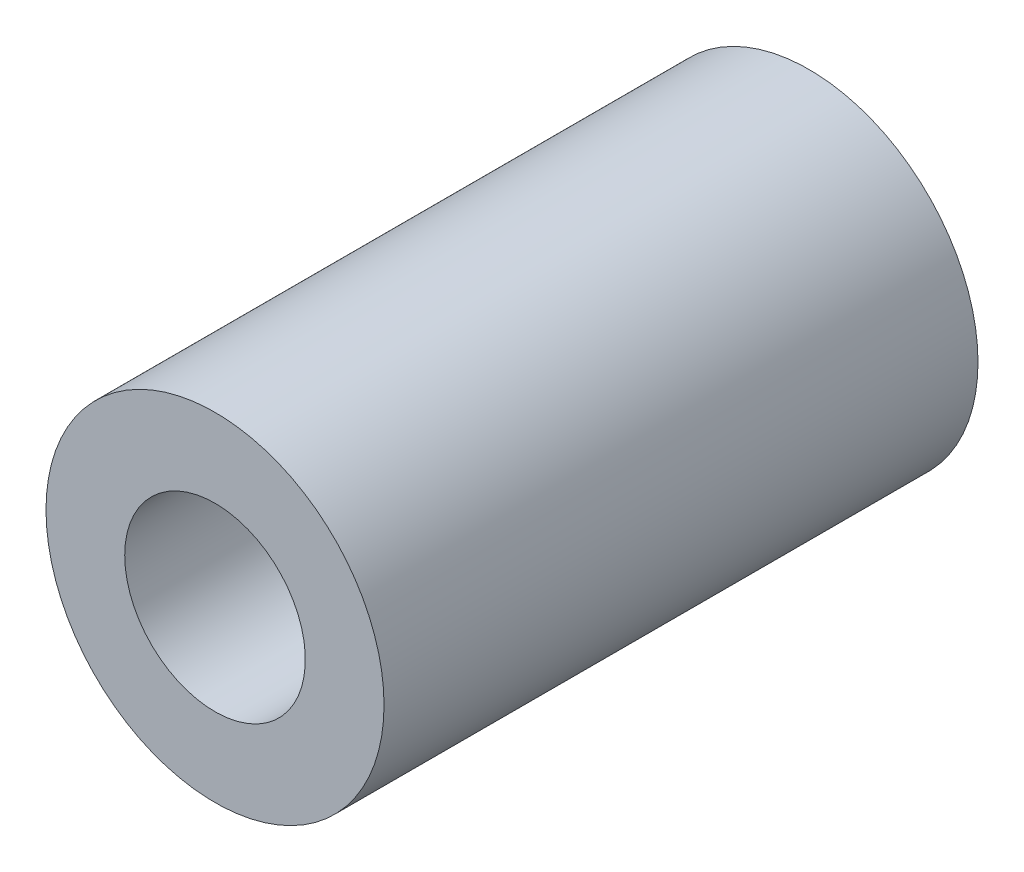
ISO-10303-21;
HEADER;
FILE_DESCRIPTION(('STEP AP214'),'2;1');
FILE_NAME('part.step','',(''),(''),'','','');
FILE_SCHEMA(('AUTOMOTIVE_DESIGN { 1 0 10303 214 1 1 1 1 }'));
ENDSEC;
DATA;
#1=APPLICATION_CONTEXT('core data for automotive mechanical design processes');
#2=APPLICATION_PROTOCOL_DEFINITION('international standard','automotive_design',2000,#1);
#3=PRODUCT_CONTEXT('',#1,'mechanical');
#4=PRODUCT('Part','Part','',(#3));
#5=PRODUCT_RELATED_PRODUCT_CATEGORY('part','',(#4));
#6=PRODUCT_DEFINITION_FORMATION('','',#4);
#7=PRODUCT_DEFINITION_CONTEXT('part definition',#1,'design');
#8=PRODUCT_DEFINITION('design','',#6,#7);
#9=PRODUCT_DEFINITION_SHAPE('','',#8);
#10=(LENGTH_UNIT() NAMED_UNIT(*) SI_UNIT(.MILLI.,.METRE.));
#11=(NAMED_UNIT(*) PLANE_ANGLE_UNIT() SI_UNIT($,.RADIAN.));
#12=(NAMED_UNIT(*) SI_UNIT($,.STERADIAN.) SOLID_ANGLE_UNIT());
#13=UNCERTAINTY_MEASURE_WITH_UNIT(LENGTH_MEASURE(1.E-05),#10,'distance_accuracy_value','');
#14=(GEOMETRIC_REPRESENTATION_CONTEXT(3) GLOBAL_UNCERTAINTY_ASSIGNED_CONTEXT((#13)) GLOBAL_UNIT_ASSIGNED_CONTEXT((#10,
#11,#12)) REPRESENTATION_CONTEXT('',''));
#15=CARTESIAN_POINT('',(0.,0.,0.));
#16=DIRECTION('',(0.,0.,1.));
#17=DIRECTION('',(1.,0.,0.));
#18=AXIS2_PLACEMENT_3D('',#15,#16,#17);
#19=CARTESIAN_POINT('',(0.,0.,31.242));
#20=DIRECTION('',(0.,0.,1.));
#21=DIRECTION('',(1.,0.,0.));
#22=AXIS2_PLACEMENT_3D('',#19,#20,#21);
#23=PLANE('',#22);
#24=CARTESIAN_POINT('',(0.,0.,31.242));
#25=DIRECTION('',(0.,0.,1.));
#26=DIRECTION('',(1.,0.,0.));
#27=AXIS2_PLACEMENT_3D('',#24,#25,#26);
#28=CIRCLE('',#27,8.89);
#29=CARTESIAN_POINT('',(-8.89,0.,31.242));
#30=VERTEX_POINT('',#29);
#31=EDGE_CURVE('E10',#30,#30,#28,.T.);
#32=ORIENTED_EDGE('',*,*,#31,.T.);
#33=EDGE_LOOP('',(#32));
#34=FACE_BOUND('',#33,.T.);
#35=CARTESIAN_POINT('',(0.,0.,31.242));
#36=DIRECTION('',(0.,0.,1.));
#37=DIRECTION('',(1.,0.,0.));
#38=AXIS2_PLACEMENT_3D('',#35,#36,#37);
#39=CIRCLE('',#38,4.750000017);
#40=CARTESIAN_POINT('',(-4.750000017,0.,31.242));
#41=VERTEX_POINT('',#40);
#42=EDGE_CURVE('E50',#41,#41,#39,.T.);
#43=ORIENTED_EDGE('',*,*,#42,.F.);
#44=EDGE_LOOP('',(#43));
#45=FACE_BOUND('',#44,.T.);
#46=ADVANCED_FACE('F39',(#34,#45),#23,.T.);
#47=CARTESIAN_POINT('',(0.,0.,0.));
#48=DIRECTION('',(0.,0.,1.));
#49=DIRECTION('',(1.,0.,0.));
#50=AXIS2_PLACEMENT_3D('',#47,#48,#49);
#51=PLANE('',#50);
#52=CARTESIAN_POINT('',(0.,0.,0.));
#53=DIRECTION('',(0.,0.,1.));
#54=DIRECTION('',(1.,0.,0.));
#55=AXIS2_PLACEMENT_3D('',#52,#53,#54);
#56=CIRCLE('',#55,8.89);
#57=CARTESIAN_POINT('',(-8.89,0.,0.));
#58=VERTEX_POINT('',#57);
#59=EDGE_CURVE('E43',#58,#58,#56,.T.);
#60=ORIENTED_EDGE('',*,*,#59,.F.);
#61=EDGE_LOOP('',(#60));
#62=FACE_BOUND('',#61,.T.);
#63=CARTESIAN_POINT('',(0.,0.,0.));
#64=DIRECTION('',(0.,0.,1.));
#65=DIRECTION('',(1.,0.,0.));
#66=AXIS2_PLACEMENT_3D('',#63,#64,#65);
#67=CIRCLE('',#66,4.750000017);
#68=CARTESIAN_POINT('',(-4.750000017,0.,0.));
#69=VERTEX_POINT('',#68);
#70=EDGE_CURVE('E52',#69,#69,#67,.T.);
#71=ORIENTED_EDGE('',*,*,#70,.T.);
#72=EDGE_LOOP('',(#71));
#73=FACE_BOUND('',#72,.T.);
#74=ADVANCED_FACE('F62',(#62,#73),#51,.F.);
#75=CARTESIAN_POINT('',(0.,0.,31.242));
#76=DIRECTION('',(0.,0.,-1.));
#77=DIRECTION('',(-1.,0.,0.));
#78=AXIS2_PLACEMENT_3D('',#75,#76,#77);
#79=CYLINDRICAL_SURFACE('',#78,8.89);
#80=CARTESIAN_POINT('',(-8.89,0.,31.242));
#81=CARTESIAN_POINT('',(-8.89,0.,30.9165625));
#82=CARTESIAN_POINT('',(-8.89,0.,30.591125));
#83=CARTESIAN_POINT('',(-8.89,0.,29.94025));
#84=CARTESIAN_POINT('',(-8.89,0.,29.6148125));
#85=CARTESIAN_POINT('',(-8.89,0.,28.9639375));
#86=CARTESIAN_POINT('',(-8.89,0.,28.6385));
#87=CARTESIAN_POINT('',(-8.89,0.,27.987625));
#88=CARTESIAN_POINT('',(-8.89,0.,27.6621875));
#89=CARTESIAN_POINT('',(-8.89,0.,27.0113125));
#90=CARTESIAN_POINT('',(-8.89,0.,26.685875));
#91=CARTESIAN_POINT('',(-8.89,0.,26.035));
#92=CARTESIAN_POINT('',(-8.89,0.,25.7095625));
#93=CARTESIAN_POINT('',(-8.89,0.,25.0586875));
#94=CARTESIAN_POINT('',(-8.89,0.,24.73325));
#95=CARTESIAN_POINT('',(-8.89,0.,24.082375));
#96=CARTESIAN_POINT('',(-8.89,0.,23.7569375));
#97=CARTESIAN_POINT('',(-8.89,0.,23.1060625));
#98=CARTESIAN_POINT('',(-8.89,0.,22.780625));
#99=CARTESIAN_POINT('',(-8.89,0.,22.12975));
#100=CARTESIAN_POINT('',(-8.89,0.,21.8043125));
#101=CARTESIAN_POINT('',(-8.89,0.,21.1534375));
#102=CARTESIAN_POINT('',(-8.89,0.,20.828));
#103=CARTESIAN_POINT('',(-8.89,0.,20.177125));
#104=CARTESIAN_POINT('',(-8.89,0.,19.8516875));
#105=CARTESIAN_POINT('',(-8.89,0.,19.2008125));
#106=CARTESIAN_POINT('',(-8.89,0.,18.875375));
#107=CARTESIAN_POINT('',(-8.89,0.,18.2245));
#108=CARTESIAN_POINT('',(-8.89,0.,17.8990625));
#109=CARTESIAN_POINT('',(-8.89,0.,17.2481875));
#110=CARTESIAN_POINT('',(-8.89,0.,16.92275));
#111=CARTESIAN_POINT('',(-8.89,0.,16.271875));
#112=CARTESIAN_POINT('',(-8.89,0.,15.9464375));
#113=CARTESIAN_POINT('',(-8.89,0.,15.2955625));
#114=CARTESIAN_POINT('',(-8.89,0.,14.970125));
#115=CARTESIAN_POINT('',(-8.89,0.,14.31925));
#116=CARTESIAN_POINT('',(-8.89,0.,13.9938125));
#117=CARTESIAN_POINT('',(-8.89,0.,13.3429375));
#118=CARTESIAN_POINT('',(-8.89,0.,13.0175));
#119=CARTESIAN_POINT('',(-8.89,0.,12.366625));
#120=CARTESIAN_POINT('',(-8.89,0.,12.0411875));
#121=CARTESIAN_POINT('',(-8.89,0.,11.3903125));
#122=CARTESIAN_POINT('',(-8.89,0.,11.064875));
#123=CARTESIAN_POINT('',(-8.89,0.,10.414));
#124=CARTESIAN_POINT('',(-8.89,0.,10.0885625));
#125=CARTESIAN_POINT('',(-8.89,0.,9.4376875));
#126=CARTESIAN_POINT('',(-8.89,0.,9.11225));
#127=CARTESIAN_POINT('',(-8.89,0.,8.461375));
#128=CARTESIAN_POINT('',(-8.89,0.,8.1359375));
#129=CARTESIAN_POINT('',(-8.89,0.,7.4850625));
#130=CARTESIAN_POINT('',(-8.89,0.,7.159625));
#131=CARTESIAN_POINT('',(-8.89,0.,6.50875));
#132=CARTESIAN_POINT('',(-8.89,0.,6.1833125));
#133=CARTESIAN_POINT('',(-8.89,0.,5.5324375));
#134=CARTESIAN_POINT('',(-8.89,0.,5.207));
#135=CARTESIAN_POINT('',(-8.89,0.,4.556125));
#136=CARTESIAN_POINT('',(-8.89,0.,4.2306875));
#137=CARTESIAN_POINT('',(-8.89,0.,3.5798125));
#138=CARTESIAN_POINT('',(-8.89,0.,3.254375));
#139=CARTESIAN_POINT('',(-8.89,0.,2.6035));
#140=CARTESIAN_POINT('',(-8.89,0.,2.2780625));
#141=CARTESIAN_POINT('',(-8.89,0.,1.6271875));
#142=CARTESIAN_POINT('',(-8.89,0.,1.30175));
#143=CARTESIAN_POINT('',(-8.89,0.,0.650874999999996));
#144=CARTESIAN_POINT('',(-8.89,0.,0.325437499999996));
#145=CARTESIAN_POINT('',(-8.89,0.,0.));
#146=B_SPLINE_CURVE_WITH_KNOTS('',3,(#80,#81,#82,#83,#84,#85,#86,#87,#88,#89,#90,#91,#92,#93,
#94,#95,#96,#97,#98,#99,#100,#101,#102,#103,#104,#105,#106,#107,#108,#109,#110,#111,#112,#113,
#114,#115,#116,#117,#118,#119,#120,#121,#122,#123,#124,#125,#126,#127,#128,#129,#130,#131,#132,
#133,#134,#135,#136,#137,#138,#139,#140,#141,#142,#143,#144,#145),.UNSPECIFIED.,.F.,.F.,(4,2,2,
2,2,2,2,2,2,2,2,2,2,2,2,2,2,2,2,2,2,2,2,2,2,2,2,2,2,2,2,2,4),(0.,0.976312500000003,1.952625,
2.9289375,3.90525,4.8815625,5.857875,6.8341875,7.8105,8.7868125,9.763125,10.7394375,11.71575,
12.6920625,13.668375,14.6446875,15.621,16.5973125,17.573625,18.5499375,19.52625,20.5025625,
21.478875,22.4551875,23.4315,24.4078125,25.384125,26.3604375,27.33675,28.3130625,29.289375,
30.2656875,31.242),.UNSPECIFIED.);
#147=EDGE_CURVE('BSEAM41',#30,#58,#146,.T.);
#148=ORIENTED_EDGE('',*,*,#31,.F.);
#149=ORIENTED_EDGE('',*,*,#59,.T.);
#150=ORIENTED_EDGE('',*,*,#147,.T.);
#151=ORIENTED_EDGE('',*,*,#147,.F.);
#152=EDGE_LOOP('',(#148,#150,#149,#151));
#153=FACE_BOUND('',#152,.T.);
#154=ADVANCED_FACE('F41',(#153),#79,.T.);
#155=CARTESIAN_POINT('',(0.,0.,31.242));
#156=DIRECTION('',(0.,0.,-1.));
#157=DIRECTION('',(-1.,0.,0.));
#158=AXIS2_PLACEMENT_3D('',#155,#156,#157);
#159=CYLINDRICAL_SURFACE('',#158,4.750000017);
#160=CARTESIAN_POINT('',(-4.750000017,0.,31.242));
#161=CARTESIAN_POINT('',(-4.750000017,0.,30.9165625));
#162=CARTESIAN_POINT('',(-4.750000017,0.,30.591125));
#163=CARTESIAN_POINT('',(-4.750000017,0.,29.94025));
#164=CARTESIAN_POINT('',(-4.750000017,0.,29.6148125));
#165=CARTESIAN_POINT('',(-4.750000017,0.,28.9639375));
#166=CARTESIAN_POINT('',(-4.750000017,0.,28.6385));
#167=CARTESIAN_POINT('',(-4.750000017,0.,27.987625));
#168=CARTESIAN_POINT('',(-4.750000017,0.,27.6621875));
#169=CARTESIAN_POINT('',(-4.750000017,0.,27.0113125));
#170=CARTESIAN_POINT('',(-4.750000017,0.,26.685875));
#171=CARTESIAN_POINT('',(-4.750000017,0.,26.035));
#172=CARTESIAN_POINT('',(-4.750000017,0.,25.7095625));
#173=CARTESIAN_POINT('',(-4.750000017,0.,25.0586875));
#174=CARTESIAN_POINT('',(-4.750000017,0.,24.73325));
#175=CARTESIAN_POINT('',(-4.750000017,0.,24.082375));
#176=CARTESIAN_POINT('',(-4.750000017,0.,23.7569375));
#177=CARTESIAN_POINT('',(-4.750000017,0.,23.1060625));
#178=CARTESIAN_POINT('',(-4.750000017,0.,22.780625));
#179=CARTESIAN_POINT('',(-4.750000017,0.,22.12975));
#180=CARTESIAN_POINT('',(-4.750000017,0.,21.8043125));
#181=CARTESIAN_POINT('',(-4.750000017,0.,21.1534375));
#182=CARTESIAN_POINT('',(-4.750000017,0.,20.828));
#183=CARTESIAN_POINT('',(-4.750000017,0.,20.177125));
#184=CARTESIAN_POINT('',(-4.750000017,0.,19.8516875));
#185=CARTESIAN_POINT('',(-4.750000017,0.,19.2008125));
#186=CARTESIAN_POINT('',(-4.750000017,0.,18.875375));
#187=CARTESIAN_POINT('',(-4.750000017,0.,18.2245));
#188=CARTESIAN_POINT('',(-4.750000017,0.,17.8990625));
#189=CARTESIAN_POINT('',(-4.750000017,0.,17.2481875));
#190=CARTESIAN_POINT('',(-4.750000017,0.,16.92275));
#191=CARTESIAN_POINT('',(-4.750000017,0.,16.271875));
#192=CARTESIAN_POINT('',(-4.750000017,0.,15.9464375));
#193=CARTESIAN_POINT('',(-4.750000017,0.,15.2955625));
#194=CARTESIAN_POINT('',(-4.750000017,0.,14.970125));
#195=CARTESIAN_POINT('',(-4.750000017,0.,14.31925));
#196=CARTESIAN_POINT('',(-4.750000017,0.,13.9938125));
#197=CARTESIAN_POINT('',(-4.750000017,0.,13.3429375));
#198=CARTESIAN_POINT('',(-4.750000017,0.,13.0175));
#199=CARTESIAN_POINT('',(-4.750000017,0.,12.366625));
#200=CARTESIAN_POINT('',(-4.750000017,0.,12.0411875));
#201=CARTESIAN_POINT('',(-4.750000017,0.,11.3903125));
#202=CARTESIAN_POINT('',(-4.750000017,0.,11.064875));
#203=CARTESIAN_POINT('',(-4.750000017,0.,10.414));
#204=CARTESIAN_POINT('',(-4.750000017,0.,10.0885625));
#205=CARTESIAN_POINT('',(-4.750000017,0.,9.4376875));
#206=CARTESIAN_POINT('',(-4.750000017,0.,9.11225));
#207=CARTESIAN_POINT('',(-4.750000017,0.,8.461375));
#208=CARTESIAN_POINT('',(-4.750000017,0.,8.1359375));
#209=CARTESIAN_POINT('',(-4.750000017,0.,7.4850625));
#210=CARTESIAN_POINT('',(-4.750000017,0.,7.159625));
#211=CARTESIAN_POINT('',(-4.750000017,0.,6.50875));
#212=CARTESIAN_POINT('',(-4.750000017,0.,6.1833125));
#213=CARTESIAN_POINT('',(-4.750000017,0.,5.5324375));
#214=CARTESIAN_POINT('',(-4.750000017,0.,5.207));
#215=CARTESIAN_POINT('',(-4.750000017,0.,4.556125));
#216=CARTESIAN_POINT('',(-4.750000017,0.,4.2306875));
#217=CARTESIAN_POINT('',(-4.750000017,0.,3.5798125));
#218=CARTESIAN_POINT('',(-4.750000017,0.,3.254375));
#219=CARTESIAN_POINT('',(-4.750000017,0.,2.6035));
#220=CARTESIAN_POINT('',(-4.750000017,0.,2.2780625));
#221=CARTESIAN_POINT('',(-4.750000017,0.,1.6271875));
#222=CARTESIAN_POINT('',(-4.750000017,0.,1.30175));
#223=CARTESIAN_POINT('',(-4.750000017,0.,0.650874999999996));
#224=CARTESIAN_POINT('',(-4.750000017,0.,0.325437499999996));
#225=CARTESIAN_POINT('',(-4.750000017,0.,0.));
#226=B_SPLINE_CURVE_WITH_KNOTS('',3,(#160,#161,#162,#163,#164,#165,#166,#167,#168,#169,#170,
#171,#172,#173,#174,#175,#176,#177,#178,#179,#180,#181,#182,#183,#184,#185,#186,#187,#188,#189,
#190,#191,#192,#193,#194,#195,#196,#197,#198,#199,#200,#201,#202,#203,#204,#205,#206,#207,#208,
#209,#210,#211,#212,#213,#214,#215,#216,#217,#218,#219,#220,#221,#222,#223,#224,#225),
.UNSPECIFIED.,.F.,.F.,(4,2,2,2,2,2,2,2,2,2,2,2,2,2,2,2,2,2,2,2,2,2,2,2,2,2,2,2,2,2,2,2,4),(0.,
0.976312500000003,1.952625,2.9289375,3.90525,4.8815625,5.857875,6.8341875,7.8105,8.7868125,
9.763125,10.7394375,11.71575,12.6920625,13.668375,14.6446875,15.621,16.5973125,17.573625,
18.5499375,19.52625,20.5025625,21.478875,22.4551875,23.4315,24.4078125,25.384125,26.3604375,
27.33675,28.3130625,29.289375,30.2656875,31.242),.UNSPECIFIED.);
#227=EDGE_CURVE('BSEAM58',#41,#69,#226,.T.);
#228=ORIENTED_EDGE('',*,*,#42,.T.);
#229=ORIENTED_EDGE('',*,*,#70,.F.);
#230=ORIENTED_EDGE('',*,*,#227,.T.);
#231=ORIENTED_EDGE('',*,*,#227,.F.);
#232=EDGE_LOOP('',(#228,#230,#229,#231));
#233=FACE_BOUND('',#232,.T.);
#234=ADVANCED_FACE('F58',(#233),#159,.F.);
#235=CLOSED_SHELL('',(#46,#74,#154,#234));
#236=MANIFOLD_SOLID_BREP('B2',#235);
#237=ADVANCED_BREP_SHAPE_REPRESENTATION('',(#18,#236),#14);
#238=SHAPE_DEFINITION_REPRESENTATION(#9,#237);
ENDSEC;
END-ISO-10303-21;
